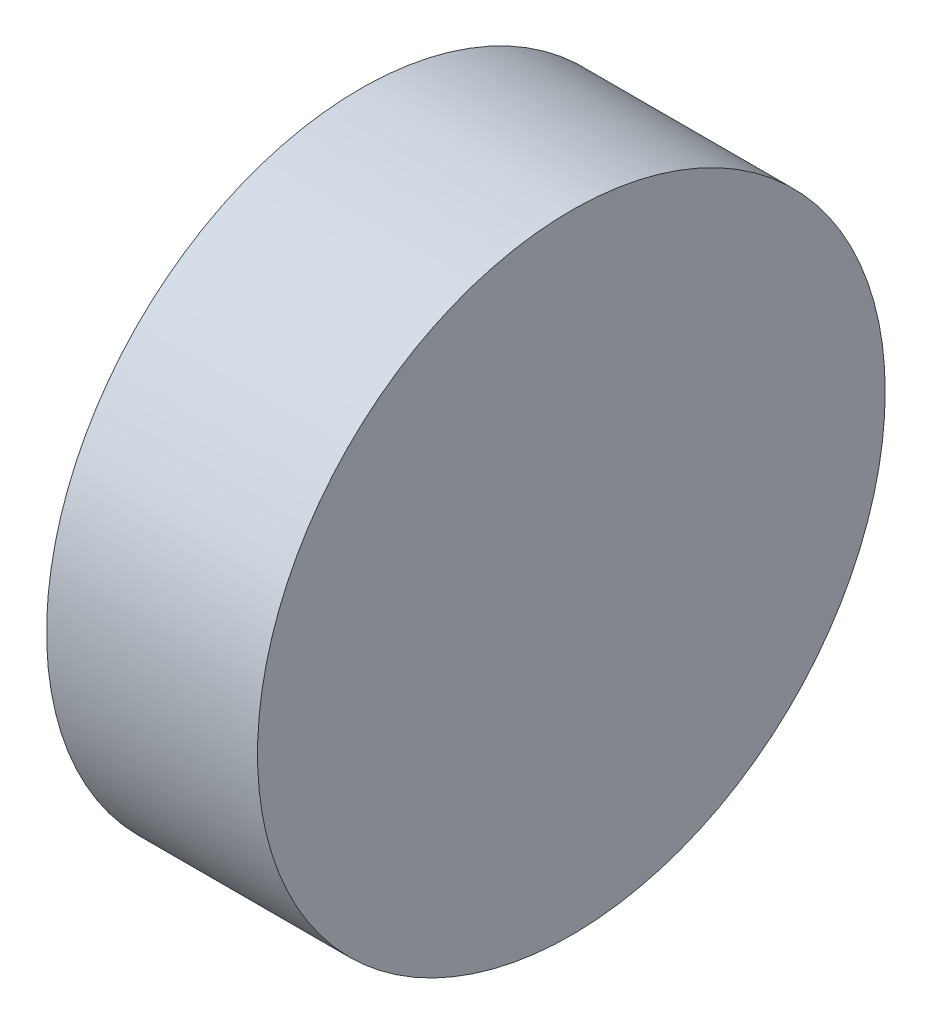
ISO-10303-21;
HEADER;
FILE_DESCRIPTION(('STEP AP214'),'2;1');
FILE_NAME('part.step','',(''),(''),'','','');
FILE_SCHEMA(('AUTOMOTIVE_DESIGN { 1 0 10303 214 1 1 1 1 }'));
ENDSEC;
DATA;
#1=APPLICATION_CONTEXT('core data for automotive mechanical design processes');
#2=APPLICATION_PROTOCOL_DEFINITION('international standard','automotive_design',2000,#1);
#3=PRODUCT_CONTEXT('',#1,'mechanical');
#4=PRODUCT('Part','Part','',(#3));
#5=PRODUCT_RELATED_PRODUCT_CATEGORY('part','',(#4));
#6=PRODUCT_DEFINITION_FORMATION('','',#4);
#7=PRODUCT_DEFINITION_CONTEXT('part definition',#1,'design');
#8=PRODUCT_DEFINITION('design','',#6,#7);
#9=PRODUCT_DEFINITION_SHAPE('','',#8);
#10=(LENGTH_UNIT() NAMED_UNIT(*) SI_UNIT(.MILLI.,.METRE.));
#11=(NAMED_UNIT(*) PLANE_ANGLE_UNIT() SI_UNIT($,.RADIAN.));
#12=(NAMED_UNIT(*) SI_UNIT($,.STERADIAN.) SOLID_ANGLE_UNIT());
#13=UNCERTAINTY_MEASURE_WITH_UNIT(LENGTH_MEASURE(1.E-05),#10,'distance_accuracy_value','');
#14=(GEOMETRIC_REPRESENTATION_CONTEXT(3) GLOBAL_UNCERTAINTY_ASSIGNED_CONTEXT((#13)) GLOBAL_UNIT_ASSIGNED_CONTEXT((#10,
#11,#12)) REPRESENTATION_CONTEXT('',''));
#15=CARTESIAN_POINT('',(0.,0.,0.));
#16=DIRECTION('',(0.,0.,1.));
#17=DIRECTION('',(1.,0.,0.));
#18=AXIS2_PLACEMENT_3D('',#15,#16,#17);
#19=CARTESIAN_POINT('',(4.2,0.,0.));
#20=DIRECTION('',(-1.,0.,0.));
#21=DIRECTION('',(0.,0.,1.));
#22=AXIS2_PLACEMENT_3D('',#19,#20,#21);
#23=CYLINDRICAL_SURFACE('',#22,6.25);
#24=CARTESIAN_POINT('',(4.2,0.,0.));
#25=DIRECTION('',(1.,0.,0.));
#26=DIRECTION('',(0.,0.,-1.));
#27=AXIS2_PLACEMENT_3D('',#24,#25,#26);
#28=CIRCLE('',#27,6.25);
#29=CARTESIAN_POINT('',(4.2,0.,-6.25));
#30=VERTEX_POINT('',#29);
#31=EDGE_CURVE('E10',#30,#30,#28,.T.);
#32=ORIENTED_EDGE('',*,*,#31,.F.);
#33=EDGE_LOOP('',(#32));
#34=FACE_BOUND('',#33,.T.);
#35=CARTESIAN_POINT('',(0.,0.,0.));
#36=DIRECTION('',(1.,0.,0.));
#37=DIRECTION('',(0.,0.,-1.));
#38=AXIS2_PLACEMENT_3D('',#35,#36,#37);
#39=CIRCLE('',#38,6.25);
#40=CARTESIAN_POINT('',(0.,0.,-6.25));
#41=VERTEX_POINT('',#40);
#42=EDGE_CURVE('E42',#41,#41,#39,.T.);
#43=ORIENTED_EDGE('',*,*,#42,.T.);
#44=EDGE_LOOP('',(#43));
#45=FACE_BOUND('',#44,.T.);
#46=ADVANCED_FACE('F39',(#34,#45),#23,.T.);
#47=CARTESIAN_POINT('',(4.2,0.,0.));
#48=DIRECTION('',(1.,0.,0.));
#49=DIRECTION('',(0.,0.,-1.));
#50=AXIS2_PLACEMENT_3D('',#47,#48,#49);
#51=PLANE('',#50);
#52=ORIENTED_EDGE('',*,*,#31,.T.);
#53=EDGE_LOOP('',(#52));
#54=FACE_BOUND('',#53,.T.);
#55=ADVANCED_FACE('F58',(#54),#51,.T.);
#56=CARTESIAN_POINT('',(0.,0.,0.));
#57=DIRECTION('',(1.,0.,0.));
#58=DIRECTION('',(0.,0.,-1.));
#59=AXIS2_PLACEMENT_3D('',#56,#57,#58);
#60=PLANE('',#59);
#61=ORIENTED_EDGE('',*,*,#42,.F.);
#62=EDGE_LOOP('',(#61));
#63=FACE_BOUND('',#62,.T.);
#64=ADVANCED_FACE('F56',(#63),#60,.F.);
#65=CLOSED_SHELL('',(#46,#55,#64));
#66=MANIFOLD_SOLID_BREP('B2',#65);
#67=ADVANCED_BREP_SHAPE_REPRESENTATION('',(#18,#66),#14);
#68=SHAPE_DEFINITION_REPRESENTATION(#9,#67);
ENDSEC;
END-ISO-10303-21;
